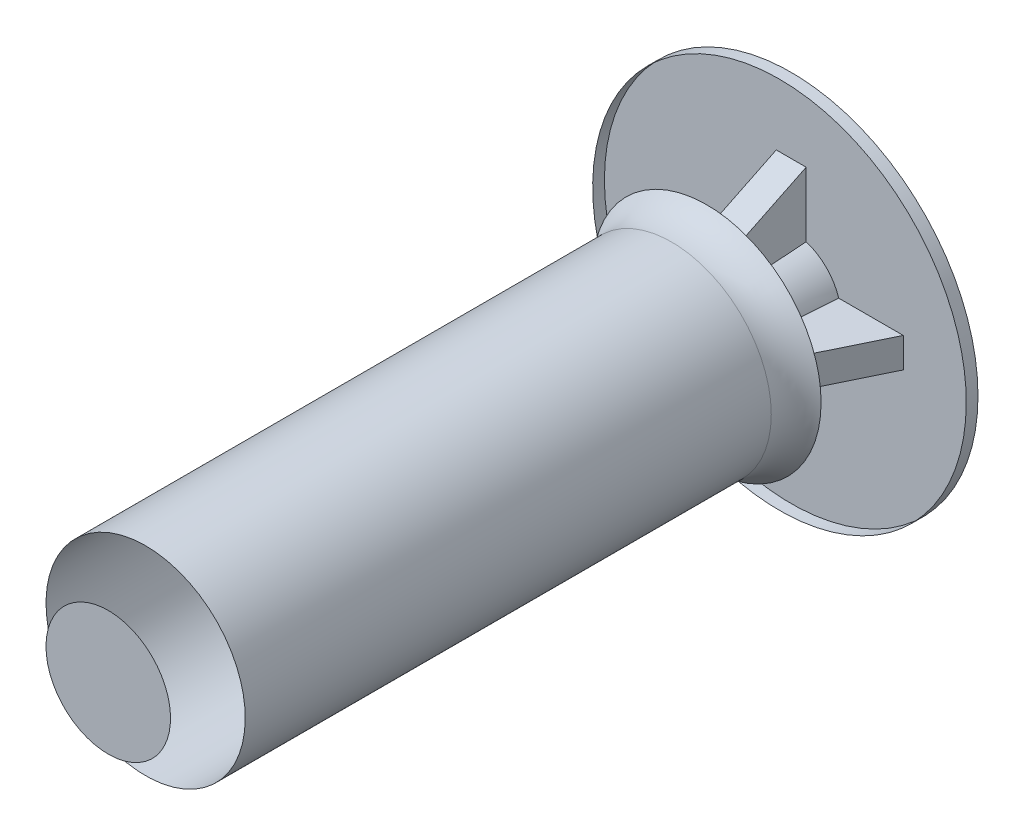
ISO-10303-21;
HEADER;
FILE_DESCRIPTION(('STEP AP214'),'2;1');
FILE_NAME('part.step','',(''),(''),'','','');
FILE_SCHEMA(('AUTOMOTIVE_DESIGN { 1 0 10303 214 1 1 1 1 }'));
ENDSEC;
DATA;
#1=APPLICATION_CONTEXT('core data for automotive mechanical design processes');
#2=APPLICATION_PROTOCOL_DEFINITION('international standard','automotive_design',2000,#1);
#3=PRODUCT_CONTEXT('',#1,'mechanical');
#4=PRODUCT('Part','Part','',(#3));
#5=PRODUCT_RELATED_PRODUCT_CATEGORY('part','',(#4));
#6=PRODUCT_DEFINITION_FORMATION('','',#4);
#7=PRODUCT_DEFINITION_CONTEXT('part definition',#1,'design');
#8=PRODUCT_DEFINITION('design','',#6,#7);
#9=PRODUCT_DEFINITION_SHAPE('','',#8);
#10=(LENGTH_UNIT() NAMED_UNIT(*) SI_UNIT(.MILLI.,.METRE.));
#11=(NAMED_UNIT(*) PLANE_ANGLE_UNIT() SI_UNIT($,.RADIAN.));
#12=(NAMED_UNIT(*) SI_UNIT($,.STERADIAN.) SOLID_ANGLE_UNIT());
#13=UNCERTAINTY_MEASURE_WITH_UNIT(LENGTH_MEASURE(1.E-05),#10,'distance_accuracy_value','');
#14=(GEOMETRIC_REPRESENTATION_CONTEXT(3) GLOBAL_UNCERTAINTY_ASSIGNED_CONTEXT((#13)) GLOBAL_UNIT_ASSIGNED_CONTEXT((#10,
#11,#12)) REPRESENTATION_CONTEXT('',''));
#15=CARTESIAN_POINT('',(0.,0.,0.));
#16=DIRECTION('',(0.,0.,1.));
#17=DIRECTION('',(1.,0.,0.));
#18=AXIS2_PLACEMENT_3D('',#15,#16,#17);
#19=CARTESIAN_POINT('',(125.418170518272,25.8086591382427,0.960431402518415));
#20=DIRECTION('',(0.,-0.898794046299167,-0.438371146789077));
#21=DIRECTION('',(0.,0.438371146789077,-0.898794046299167));
#22=AXIS2_PLACEMENT_3D('',#19,#20,#21);
#23=PLANE('',#22);
#24=DIRECTION('',(0.,-0.438371146789077,0.898794046299168));
#25=VECTOR('',#24,1.);
#26=CARTESIAN_POINT('',(125.818170518272,26.7353510565178,-0.939568597481593));
#27=LINE('',#26,#25);
#28=CARTESIAN_POINT('',(125.818170518272,26.7353510565178,-0.939568597481593));
#29=VERTEX_POINT('',#28);
#30=CARTESIAN_POINT('',(125.818170518272,25.8086591382427,0.960431402518415));
#31=VERTEX_POINT('',#30);
#32=EDGE_CURVE('E11',#29,#31,#27,.T.);
#33=ORIENTED_EDGE('',*,*,#32,.T.);
#34=DIRECTION('',(1.,0.,0.));
#35=VECTOR('',#34,1.);
#36=CARTESIAN_POINT('',(125.418170518272,25.8086591382427,0.960431402518415));
#37=LINE('',#36,#35);
#38=CARTESIAN_POINT('',(125.418170518272,25.8086591382427,0.960431402518415));
#39=VERTEX_POINT('',#38);
#40=EDGE_CURVE('E222',#39,#31,#37,.T.);
#41=ORIENTED_EDGE('',*,*,#40,.F.);
#42=DIRECTION('',(0.,-0.438371146789077,0.898794046299168));
#43=VECTOR('',#42,1.);
#44=CARTESIAN_POINT('',(125.418170518272,26.7353510565178,-0.939568597481593));
#45=LINE('',#44,#43);
#46=CARTESIAN_POINT('',(125.418170518272,26.7353510565178,-0.939568597481593));
#47=VERTEX_POINT('',#46);
#48=EDGE_CURVE('E50',#47,#39,#45,.T.);
#49=ORIENTED_EDGE('',*,*,#48,.F.);
#50=DIRECTION('',(1.,0.,0.));
#51=VECTOR('',#50,1.);
#52=CARTESIAN_POINT('',(125.418170518272,26.7353510565178,-0.939568597481593));
#53=LINE('',#52,#51);
#54=EDGE_CURVE('E251',#47,#29,#53,.T.);
#55=ORIENTED_EDGE('',*,*,#54,.T.);
#56=EDGE_LOOP('',(#33,#41,#49,#55));
#57=FACE_BOUND('',#56,.T.);
#58=ADVANCED_FACE('F40',(#57),#23,.T.);
#59=CARTESIAN_POINT('',(125.818170518272,25.2353510565178,22.3937647358519));
#60=DIRECTION('',(-1.,0.,0.));
#61=DIRECTION('',(0.,0.,1.));
#62=AXIS2_PLACEMENT_3D('',#59,#60,#61);
#63=PLANE('',#62);
#64=CARTESIAN_POINT('',(125.818170518272,25.8713105241291,-0.939568597481595));
#65=CARTESIAN_POINT('',(125.818170518272,25.7929876372384,0.128909574146506));
#66=CARTESIAN_POINT('',(125.818170518272,25.7302738292281,0.960431402521579));
#67=(BOUNDED_CURVE() B_SPLINE_CURVE(2,(#64,#65,#66),.UNSPECIFIED.,.F.,
.F.) B_SPLINE_CURVE_WITH_KNOTS((3,3),(-0.308985655980768,-0.121232772554277),
.UNSPECIFIED.) CURVE() GEOMETRIC_REPRESENTATION_ITEM() RATIONAL_B_SPLINE_CURVE((1.01015110004332,
1.01867499152316,1.0130918345203)) REPRESENTATION_ITEM(''));
#68=CARTESIAN_POINT('',(125.818170518272,25.8713105241291,-0.939568597481597));
#69=VERTEX_POINT('',#68);
#70=CARTESIAN_POINT('',(125.818170518272,25.7302738292282,0.960431402518415));
#71=VERTEX_POINT('',#70);
#72=EDGE_CURVE('E275',#69,#71,#67,.T.);
#73=ORIENTED_EDGE('',*,*,#72,.T.);
#74=DIRECTION('',(0.,-1.,0.));
#75=VECTOR('',#74,1.);
#76=CARTESIAN_POINT('',(125.818170518272,25.8086591382427,0.960431402518415));
#77=LINE('',#76,#75);
#78=EDGE_CURVE('E218',#31,#71,#77,.T.);
#79=ORIENTED_EDGE('',*,*,#78,.F.);
#80=ORIENTED_EDGE('',*,*,#32,.F.);
#81=DIRECTION('',(0.,1.,0.));
#82=VECTOR('',#81,1.);
#83=CARTESIAN_POINT('',(125.818170518272,25.8713105241291,-0.939568597481597));
#84=LINE('',#83,#82);
#85=EDGE_CURVE('E249',#69,#29,#84,.T.);
#86=ORIENTED_EDGE('',*,*,#85,.F.);
#87=EDGE_LOOP('',(#73,#79,#80,#86));
#88=FACE_BOUND('',#87,.T.);
#89=ADVANCED_FACE('F424',(#88),#63,.T.);
#90=CARTESIAN_POINT('',(125.418170518272,25.2353510565178,22.3937647358519));
#91=DIRECTION('',(1.,0.,0.));
#92=DIRECTION('',(0.,1.,0.));
#93=AXIS2_PLACEMENT_3D('',#90,#91,#92);
#94=PLANE('',#93);
#95=DIRECTION('',(0.,1.,0.));
#96=VECTOR('',#95,1.);
#97=CARTESIAN_POINT('',(125.418170518272,25.8713105241291,-0.939568597481591));
#98=LINE('',#97,#96);
#99=CARTESIAN_POINT('',(125.418170518272,25.8713105241291,-0.939568597481591));
#100=VERTEX_POINT('',#99);
#101=EDGE_CURVE('E253',#100,#47,#98,.T.);
#102=ORIENTED_EDGE('',*,*,#101,.T.);
#103=ORIENTED_EDGE('',*,*,#48,.T.);
#104=DIRECTION('',(0.,-1.,0.));
#105=VECTOR('',#104,1.);
#106=CARTESIAN_POINT('',(125.418170518272,25.8086591382427,0.960431402518415));
#107=LINE('',#106,#105);
#108=CARTESIAN_POINT('',(125.418170518272,25.7302738292282,0.960431402518415));
#109=VERTEX_POINT('',#108);
#110=EDGE_CURVE('E243',#39,#109,#107,.T.);
#111=ORIENTED_EDGE('',*,*,#110,.T.);
#112=CARTESIAN_POINT('',(125.418170518272,25.8713105241291,-0.939568597481589));
#113=CARTESIAN_POINT('',(125.418170518272,25.7929876372383,0.128909574147783));
#114=CARTESIAN_POINT('',(125.418170518272,25.730273829228,0.960431402521576));
#115=(BOUNDED_CURVE() B_SPLINE_CURVE(2,(#112,#113,#114),.UNSPECIFIED.,.F.,
.F.) B_SPLINE_CURVE_WITH_KNOTS((3,3),(0.0820940839671084,0.269846967393734),
.UNSPECIFIED.) CURVE() GEOMETRIC_REPRESENTATION_ITEM() RATIONAL_B_SPLINE_CURVE((1.01015110004458,
1.01867499152554,1.01309183452199)) REPRESENTATION_ITEM(''));
#116=EDGE_CURVE('E283',#100,#109,#115,.T.);
#117=ORIENTED_EDGE('',*,*,#116,.F.);
#118=EDGE_LOOP('',(#102,#103,#111,#117));
#119=FACE_BOUND('',#118,.T.);
#120=ADVANCED_FACE('F430',(#119),#94,.T.);
#121=CARTESIAN_POINT('',(125.418170518272,24.6620429747929,0.960431402518416));
#122=DIRECTION('',(0.,0.898794046299166,-0.43837114678908));
#123=DIRECTION('',(-1.,0.,0.));
#124=AXIS2_PLACEMENT_3D('',#121,#122,#123);
#125=PLANE('',#124);
#126=DIRECTION('',(0.,-0.438371146789079,-0.898794046299166));
#127=VECTOR('',#126,1.);
#128=CARTESIAN_POINT('',(125.818170518272,24.6620429747929,0.960431402518416));
#129=LINE('',#128,#127);
#130=CARTESIAN_POINT('',(125.818170518272,24.6620429747929,0.960431402518416));
#131=VERTEX_POINT('',#130);
#132=CARTESIAN_POINT('',(125.818170518272,23.7353510565178,-0.939568597481588));
#133=VERTEX_POINT('',#132);
#134=EDGE_CURVE('E154',#131,#133,#129,.T.);
#135=ORIENTED_EDGE('',*,*,#134,.T.);
#136=DIRECTION('',(1.,0.,0.));
#137=VECTOR('',#136,1.);
#138=CARTESIAN_POINT('',(125.418170518272,23.7353510565178,-0.939568597481588));
#139=LINE('',#138,#137);
#140=CARTESIAN_POINT('',(125.418170518272,23.7353510565178,-0.939568597481588));
#141=VERTEX_POINT('',#140);
#142=EDGE_CURVE('E186',#141,#133,#139,.T.);
#143=ORIENTED_EDGE('',*,*,#142,.F.);
#144=DIRECTION('',(0.,-0.438371146789079,-0.898794046299166));
#145=VECTOR('',#144,1.);
#146=CARTESIAN_POINT('',(125.418170518272,24.6620429747929,0.960431402518416));
#147=LINE('',#146,#145);
#148=CARTESIAN_POINT('',(125.418170518272,24.6620429747929,0.960431402518416));
#149=VERTEX_POINT('',#148);
#150=EDGE_CURVE('E147',#149,#141,#147,.T.);
#151=ORIENTED_EDGE('',*,*,#150,.F.);
#152=DIRECTION('',(1.,0.,0.));
#153=VECTOR('',#152,1.);
#154=CARTESIAN_POINT('',(125.418170518272,24.6620429747929,0.960431402518416));
#155=LINE('',#154,#153);
#156=EDGE_CURVE('E271',#149,#131,#155,.T.);
#157=ORIENTED_EDGE('',*,*,#156,.T.);
#158=EDGE_LOOP('',(#135,#143,#151,#157));
#159=FACE_BOUND('',#158,.T.);
#160=ADVANCED_FACE('F457',(#159),#125,.T.);
#161=CARTESIAN_POINT('',(125.418170518272,25.2353510565178,22.3937647358519));
#162=DIRECTION('',(1.,0.,0.));
#163=DIRECTION('',(0.,1.,0.));
#164=AXIS2_PLACEMENT_3D('',#161,#162,#163);
#165=PLANE('',#164);
#166=DIRECTION('',(0.,-1.,0.));
#167=VECTOR('',#166,1.);
#168=CARTESIAN_POINT('',(125.418170518272,24.7404282838073,0.960431402518416));
#169=LINE('',#168,#167);
#170=CARTESIAN_POINT('',(125.418170518272,24.7404282838073,0.960431402518416));
#171=VERTEX_POINT('',#170);
#172=EDGE_CURVE('E236',#171,#149,#169,.T.);
#173=ORIENTED_EDGE('',*,*,#172,.T.);
#174=ORIENTED_EDGE('',*,*,#150,.T.);
#175=DIRECTION('',(0.,1.,0.));
#176=VECTOR('',#175,1.);
#177=CARTESIAN_POINT('',(125.418170518272,23.7353510565178,-0.939568597481588));
#178=LINE('',#177,#176);
#179=CARTESIAN_POINT('',(125.418170518272,24.5993915889065,-0.93956859748159));
#180=VERTEX_POINT('',#179);
#181=EDGE_CURVE('E242',#141,#180,#178,.T.);
#182=ORIENTED_EDGE('',*,*,#181,.T.);
#183=CARTESIAN_POINT('',(125.418170518272,24.7404282838076,0.960431402521571));
#184=CARTESIAN_POINT('',(125.418170518272,24.6777144757967,0.128909574139695));
#185=CARTESIAN_POINT('',(125.418170518272,24.5993915889065,-0.939568597481591));
#186=(BOUNDED_CURVE() B_SPLINE_CURVE(2,(#183,#184,#185),.UNSPECIFIED.,.F.,
.F.) B_SPLINE_CURVE_WITH_KNOTS((3,3),(0.121232772553211,0.308985655980115),
.UNSPECIFIED.) CURVE() GEOMETRIC_REPRESENTATION_ITEM() RATIONAL_B_SPLINE_CURVE((1.01309183451937,
1.01867499152197,1.01015110004274)) REPRESENTATION_ITEM(''));
#187=EDGE_CURVE('E331',#171,#180,#186,.T.);
#188=ORIENTED_EDGE('',*,*,#187,.F.);
#189=EDGE_LOOP('',(#173,#174,#182,#188));
#190=FACE_BOUND('',#189,.T.);
#191=ADVANCED_FACE('F450',(#190),#165,.T.);
#192=CARTESIAN_POINT('',(125.818170518272,25.2353510565178,22.3937647358519));
#193=DIRECTION('',(-1.,0.,0.));
#194=DIRECTION('',(0.,0.,1.));
#195=AXIS2_PLACEMENT_3D('',#192,#193,#194);
#196=PLANE('',#195);
#197=CARTESIAN_POINT('',(125.818170518272,24.7404282838075,0.960431402521576));
#198=CARTESIAN_POINT('',(125.818170518272,24.6777144757971,0.1289095741461));
#199=CARTESIAN_POINT('',(125.818170518272,24.5993915889065,-0.939568597481596));
#200=(BOUNDED_CURVE() B_SPLINE_CURVE(2,(#197,#198,#199),.UNSPECIFIED.,.F.,
.F.) B_SPLINE_CURVE_WITH_KNOTS((3,3),(-0.269846967394133,-0.0820940839673807),
.UNSPECIFIED.) CURVE() GEOMETRIC_REPRESENTATION_ITEM() RATIONAL_B_SPLINE_CURVE((1.01309183452152,
1.01867499152493,1.01015110004428)) REPRESENTATION_ITEM(''));
#201=CARTESIAN_POINT('',(125.818170518272,24.7404282838073,0.960431402518416));
#202=VERTEX_POINT('',#201);
#203=CARTESIAN_POINT('',(125.818170518272,24.5993915889065,-0.939568597481596));
#204=VERTEX_POINT('',#203);
#205=EDGE_CURVE('E190',#202,#204,#200,.T.);
#206=ORIENTED_EDGE('',*,*,#205,.T.);
#207=DIRECTION('',(0.,1.,0.));
#208=VECTOR('',#207,1.);
#209=CARTESIAN_POINT('',(125.818170518272,23.7353510565178,-0.939568597481588));
#210=LINE('',#209,#208);
#211=EDGE_CURVE('E177',#133,#204,#210,.T.);
#212=ORIENTED_EDGE('',*,*,#211,.F.);
#213=ORIENTED_EDGE('',*,*,#134,.F.);
#214=DIRECTION('',(0.,-1.,0.));
#215=VECTOR('',#214,1.);
#216=CARTESIAN_POINT('',(125.818170518272,24.7404282838073,0.960431402518416));
#217=LINE('',#216,#215);
#218=EDGE_CURVE('E193',#202,#131,#217,.T.);
#219=ORIENTED_EDGE('',*,*,#218,.F.);
#220=EDGE_LOOP('',(#206,#212,#213,#219));
#221=FACE_BOUND('',#220,.T.);
#222=ADVANCED_FACE('F191',(#221),#196,.T.);
#223=CARTESIAN_POINT('',(124.118170518272,25.4353510565178,-0.939568597481597));
#224=DIRECTION('',(0.898794046299166,0.,-0.438371146789079));
#225=DIRECTION('',(0.,-1.,0.));
#226=AXIS2_PLACEMENT_3D('',#223,#224,#225);
#227=PLANE('',#226);
#228=DIRECTION('',(-0.438371146789087,0.,-0.898794046299162));
#229=VECTOR('',#228,1.);
#230=CARTESIAN_POINT('',(125.044862436547,25.0353510565178,0.960431402518416));
#231=LINE('',#230,#229);
#232=CARTESIAN_POINT('',(125.044862436547,25.0353510565178,0.960431402518416));
#233=VERTEX_POINT('',#232);
#234=CARTESIAN_POINT('',(124.118170518272,25.0353510565178,-0.93956859748159));
#235=VERTEX_POINT('',#234);
#236=EDGE_CURVE('E115',#233,#235,#231,.T.);
#237=ORIENTED_EDGE('',*,*,#236,.T.);
#238=DIRECTION('',(0.,-1.,0.));
#239=VECTOR('',#238,1.);
#240=CARTESIAN_POINT('',(124.118170518272,25.4353510565178,-0.939568597481597));
#241=LINE('',#240,#239);
#242=CARTESIAN_POINT('',(124.118170518272,25.4353510565178,-0.939568597481597));
#243=VERTEX_POINT('',#242);
#244=EDGE_CURVE('E217',#243,#235,#241,.T.);
#245=ORIENTED_EDGE('',*,*,#244,.F.);
#246=DIRECTION('',(-0.438371146789086,0.,-0.898794046299163));
#247=VECTOR('',#246,1.);
#248=CARTESIAN_POINT('',(125.044862436547,25.4353510565178,0.960431402518415));
#249=LINE('',#248,#247);
#250=CARTESIAN_POINT('',(125.044862436547,25.4353510565178,0.960431402518415));
#251=VERTEX_POINT('',#250);
#252=EDGE_CURVE('E315',#251,#243,#249,.T.);
#253=ORIENTED_EDGE('',*,*,#252,.F.);
#254=DIRECTION('',(0.,-1.,0.));
#255=VECTOR('',#254,1.);
#256=CARTESIAN_POINT('',(125.044862436547,25.4353510565178,0.960431402518415));
#257=LINE('',#256,#255);
#258=EDGE_CURVE('E354',#251,#233,#257,.T.);
#259=ORIENTED_EDGE('',*,*,#258,.T.);
#260=EDGE_LOOP('',(#237,#245,#253,#259));
#261=FACE_BOUND('',#260,.T.);
#262=ADVANCED_FACE('F445',(#261),#227,.T.);
#263=CARTESIAN_POINT('',(125.618170518272,25.0353510565178,22.3937647358519));
#264=DIRECTION('',(0.,1.,0.));
#265=DIRECTION('',(0.,0.,-1.));
#266=AXIS2_PLACEMENT_3D('',#263,#264,#265);
#267=PLANE('',#266);
#268=DIRECTION('',(1.,0.,0.));
#269=VECTOR('',#268,1.);
#270=CARTESIAN_POINT('',(124.118170518272,25.0353510565178,-0.93956859748159));
#271=LINE('',#270,#269);
#272=CARTESIAN_POINT('',(124.982211050661,25.0353510565178,-0.939568597481596));
#273=VERTEX_POINT('',#272);
#274=EDGE_CURVE('E210',#235,#273,#271,.T.);
#275=ORIENTED_EDGE('',*,*,#274,.F.);
#276=ORIENTED_EDGE('',*,*,#236,.F.);
#277=DIRECTION('',(-1.,0.,0.));
#278=VECTOR('',#277,1.);
#279=CARTESIAN_POINT('',(125.123247745561,25.0353510565178,0.960431402518416));
#280=LINE('',#279,#278);
#281=CARTESIAN_POINT('',(125.123247745561,25.0353510565178,0.960431402518416));
#282=VERTEX_POINT('',#281);
#283=EDGE_CURVE('E286',#282,#233,#280,.T.);
#284=ORIENTED_EDGE('',*,*,#283,.F.);
#285=CARTESIAN_POINT('',(124.982211050661,25.0353510565178,-0.939568597481598));
#286=CARTESIAN_POINT('',(125.060533937551,25.0353510565178,0.128909574147523));
#287=CARTESIAN_POINT('',(125.123247745562,25.0353510565178,0.960431402521571));
#288=(BOUNDED_CURVE() B_SPLINE_CURVE(2,(#285,#286,#287),.UNSPECIFIED.,.F.,
.F.) B_SPLINE_CURVE_WITH_KNOTS((3,3),(0.0820940839668961,0.269846967394747),
.UNSPECIFIED.) CURVE() GEOMETRIC_REPRESENTATION_ITEM() RATIONAL_B_SPLINE_CURVE((1.01015110004946,
1.0186749915346,1.01309183452823)) REPRESENTATION_ITEM(''));
#289=EDGE_CURVE('E124',#273,#282,#288,.T.);
#290=ORIENTED_EDGE('',*,*,#289,.F.);
#291=EDGE_LOOP('',(#275,#276,#284,#290));
#292=FACE_BOUND('',#291,.T.);
#293=ADVANCED_FACE('F448',(#292),#267,.T.);
#294=CARTESIAN_POINT('',(125.618170518272,25.4353510565178,22.3937647358519));
#295=DIRECTION('',(0.,-1.,0.));
#296=DIRECTION('',(-1.,0.,0.));
#297=AXIS2_PLACEMENT_3D('',#294,#295,#296);
#298=PLANE('',#297);
#299=CARTESIAN_POINT('',(124.982211050661,25.4353510565178,-0.939568597481596));
#300=CARTESIAN_POINT('',(125.060533937551,25.4353510565178,0.128909574144894));
#301=CARTESIAN_POINT('',(125.123247745562,25.4353510565178,0.960431402521573));
#302=(BOUNDED_CURVE() B_SPLINE_CURVE(2,(#299,#300,#301),.UNSPECIFIED.,.F.,
.F.) B_SPLINE_CURVE_WITH_KNOTS((3,3),(-0.308985655980549,-0.121232772553838),
.UNSPECIFIED.) CURVE() GEOMETRIC_REPRESENTATION_ITEM() RATIONAL_B_SPLINE_CURVE((1.01015110004365,
1.01867499152375,1.01309183452068)) REPRESENTATION_ITEM(''));
#303=CARTESIAN_POINT('',(124.982211050661,25.4353510565178,-0.939568597481597));
#304=VERTEX_POINT('',#303);
#305=CARTESIAN_POINT('',(125.123247745561,25.4353510565178,0.960431402518415));
#306=VERTEX_POINT('',#305);
#307=EDGE_CURVE('E223',#304,#306,#302,.T.);
#308=ORIENTED_EDGE('',*,*,#307,.T.);
#309=DIRECTION('',(-1.,0.,0.));
#310=VECTOR('',#309,1.);
#311=CARTESIAN_POINT('',(125.123247745561,25.4353510565178,0.960431402518415));
#312=LINE('',#311,#310);
#313=EDGE_CURVE('E245',#306,#251,#312,.T.);
#314=ORIENTED_EDGE('',*,*,#313,.T.);
#315=ORIENTED_EDGE('',*,*,#252,.T.);
#316=DIRECTION('',(1.,0.,0.));
#317=VECTOR('',#316,1.);
#318=CARTESIAN_POINT('',(124.118170518272,25.4353510565178,-0.939568597481597));
#319=LINE('',#318,#317);
#320=EDGE_CURVE('E328',#243,#304,#319,.T.);
#321=ORIENTED_EDGE('',*,*,#320,.T.);
#322=EDGE_LOOP('',(#308,#314,#315,#321));
#323=FACE_BOUND('',#322,.T.);
#324=ADVANCED_FACE('F467',(#323),#298,.T.);
#325=CARTESIAN_POINT('',(127.118170518272,25.4353510565178,-0.939568597481597));
#326=DIRECTION('',(-0.898794046299166,0.,-0.438371146789079));
#327=DIRECTION('',(-0.438371146789079,0.,0.898794046299166));
#328=AXIS2_PLACEMENT_3D('',#325,#326,#327);
#329=PLANE('',#328);
#330=DIRECTION('',(-0.438371146789086,0.,0.898794046299163));
#331=VECTOR('',#330,1.);
#332=CARTESIAN_POINT('',(127.118170518272,25.0353510565178,-0.939568597481596));
#333=LINE('',#332,#331);
#334=CARTESIAN_POINT('',(127.118170518272,25.0353510565178,-0.939568597481596));
#335=VERTEX_POINT('',#334);
#336=CARTESIAN_POINT('',(126.191478599997,25.0353510565178,0.960431402518416));
#337=VERTEX_POINT('',#336);
#338=EDGE_CURVE('E278',#335,#337,#333,.T.);
#339=ORIENTED_EDGE('',*,*,#338,.T.);
#340=DIRECTION('',(0.,-1.,0.));
#341=VECTOR('',#340,1.);
#342=CARTESIAN_POINT('',(126.191478599997,25.4353510565178,0.960431402518415));
#343=LINE('',#342,#341);
#344=CARTESIAN_POINT('',(126.191478599997,25.4353510565178,0.960431402518415));
#345=VERTEX_POINT('',#344);
#346=EDGE_CURVE('E234',#345,#337,#343,.T.);
#347=ORIENTED_EDGE('',*,*,#346,.F.);
#348=DIRECTION('',(-0.438371146789086,0.,0.898794046299163));
#349=VECTOR('',#348,1.);
#350=CARTESIAN_POINT('',(127.118170518272,25.4353510565178,-0.939568597481597));
#351=LINE('',#350,#349);
#352=CARTESIAN_POINT('',(127.118170518272,25.4353510565178,-0.939568597481597));
#353=VERTEX_POINT('',#352);
#354=EDGE_CURVE('E239',#353,#345,#351,.T.);
#355=ORIENTED_EDGE('',*,*,#354,.F.);
#356=DIRECTION('',(0.,-1.,0.));
#357=VECTOR('',#356,1.);
#358=CARTESIAN_POINT('',(127.118170518272,25.4353510565178,-0.939568597481597));
#359=LINE('',#358,#357);
#360=EDGE_CURVE('E250',#353,#335,#359,.T.);
#361=ORIENTED_EDGE('',*,*,#360,.T.);
#362=EDGE_LOOP('',(#339,#347,#355,#361));
#363=FACE_BOUND('',#362,.T.);
#364=ADVANCED_FACE('F453',(#363),#329,.T.);
#365=CARTESIAN_POINT('',(125.618170518272,25.0353510565178,22.3937647358519));
#366=DIRECTION('',(0.,1.,0.));
#367=DIRECTION('',(0.,0.,-1.));
#368=AXIS2_PLACEMENT_3D('',#365,#366,#367);
#369=PLANE('',#368);
#370=DIRECTION('',(-1.,0.,0.));
#371=VECTOR('',#370,1.);
#372=CARTESIAN_POINT('',(126.191478599997,25.0353510565178,0.960431402518416));
#373=LINE('',#372,#371);
#374=CARTESIAN_POINT('',(126.113093290982,25.0353510565178,0.960431402518416));
#375=VERTEX_POINT('',#374);
#376=EDGE_CURVE('E269',#337,#375,#373,.T.);
#377=ORIENTED_EDGE('',*,*,#376,.F.);
#378=ORIENTED_EDGE('',*,*,#338,.F.);
#379=DIRECTION('',(1.,0.,0.));
#380=VECTOR('',#379,1.);
#381=CARTESIAN_POINT('',(126.254129985883,25.0353510565178,-0.939568597481596));
#382=LINE('',#381,#380);
#383=CARTESIAN_POINT('',(126.254129985883,25.0353510565178,-0.939568597481596));
#384=VERTEX_POINT('',#383);
#385=EDGE_CURVE('E172',#384,#335,#382,.T.);
#386=ORIENTED_EDGE('',*,*,#385,.F.);
#387=CARTESIAN_POINT('',(126.113093290982,25.0353510565178,0.960431402518416));
#388=CARTESIAN_POINT('',(126.141769472786,25.0353510565178,0.58021416040147));
#389=CARTESIAN_POINT('',(126.170105618281,25.0353510565178,0.199969956499719));
#390=CARTESIAN_POINT('',(126.216952008864,25.0353510565178,-0.433375248202636));
#391=CARTESIAN_POINT('',(126.235577000768,25.0353510565178,-0.68646940258896));
#392=CARTESIAN_POINT('',(126.254129985883,25.0353510565178,-0.939568597481596));
#393=(BOUNDED_CURVE() B_SPLINE_CURVE(3,(#387,#388,#389,#390,#391,#392),.UNSPECIFIED.,.F.,
.F.) B_SPLINE_CURVE_WITH_KNOTS((4,2,4),(0.,0.600396597970285,1.),
.UNSPECIFIED.) CURVE() GEOMETRIC_REPRESENTATION_ITEM() RATIONAL_B_SPLINE_CURVE((1.,1.,1.,1.,1.,1.)) REPRESENTATION_ITEM(''));
#394=EDGE_CURVE('E200',#375,#384,#393,.T.);
#395=ORIENTED_EDGE('',*,*,#394,.F.);
#396=EDGE_LOOP('',(#377,#378,#386,#395));
#397=FACE_BOUND('',#396,.T.);
#398=ADVANCED_FACE('F440',(#397),#369,.T.);
#399=CARTESIAN_POINT('',(125.618170518272,25.4353510565178,22.3937647358519));
#400=DIRECTION('',(0.,-1.,0.));
#401=DIRECTION('',(-1.,0.,0.));
#402=AXIS2_PLACEMENT_3D('',#399,#400,#401);
#403=PLANE('',#402);
#404=CARTESIAN_POINT('',(126.113093290982,25.4353510565178,0.960431402518415));
#405=CARTESIAN_POINT('',(126.141769472786,25.4353510565178,0.580214160401468));
#406=CARTESIAN_POINT('',(126.170105618281,25.4353510565178,0.199969956499717));
#407=CARTESIAN_POINT('',(126.216952008864,25.4353510565178,-0.433375248202638));
#408=CARTESIAN_POINT('',(126.235577000768,25.4353510565178,-0.686469402588962));
#409=CARTESIAN_POINT('',(126.254129985883,25.4353510565178,-0.939568597481597));
#410=(BOUNDED_CURVE() B_SPLINE_CURVE(3,(#404,#405,#406,#407,#408,#409),.UNSPECIFIED.,.F.,
.F.) B_SPLINE_CURVE_WITH_KNOTS((4,2,4),(0.,0.600396597970285,1.),
.UNSPECIFIED.) CURVE() GEOMETRIC_REPRESENTATION_ITEM() RATIONAL_B_SPLINE_CURVE((1.,1.,1.,1.,1.,1.)) REPRESENTATION_ITEM(''));
#411=CARTESIAN_POINT('',(126.113093290982,25.4353510565178,0.960431402518415));
#412=VERTEX_POINT('',#411);
#413=CARTESIAN_POINT('',(126.254129985883,25.4353510565178,-0.939568597481597));
#414=VERTEX_POINT('',#413);
#415=EDGE_CURVE('E276',#412,#414,#410,.T.);
#416=ORIENTED_EDGE('',*,*,#415,.T.);
#417=DIRECTION('',(1.,0.,0.));
#418=VECTOR('',#417,1.);
#419=CARTESIAN_POINT('',(126.254129985883,25.4353510565178,-0.939568597481597));
#420=LINE('',#419,#418);
#421=EDGE_CURVE('E246',#414,#353,#420,.T.);
#422=ORIENTED_EDGE('',*,*,#421,.T.);
#423=ORIENTED_EDGE('',*,*,#354,.T.);
#424=DIRECTION('',(-1.,0.,0.));
#425=VECTOR('',#424,1.);
#426=CARTESIAN_POINT('',(126.191478599997,25.4353510565178,0.960431402518415));
#427=LINE('',#426,#425);
#428=EDGE_CURVE('E221',#345,#412,#427,.T.);
#429=ORIENTED_EDGE('',*,*,#428,.T.);
#430=EDGE_LOOP('',(#416,#422,#423,#429));
#431=FACE_BOUND('',#430,.T.);
#432=ADVANCED_FACE('F436',(#431),#403,.T.);
#433=CARTESIAN_POINT('',(125.618170518272,25.2353510565178,8.20089285563543));
#434=DIRECTION('',(0.,0.,1.));
#435=DIRECTION('',(1.,0.,0.));
#436=AXIS2_PLACEMENT_3D('',#433,#434,#435);
#437=PLANE('',#436);
#438=CARTESIAN_POINT('',(125.618170518272,25.2353510565178,8.20089285563543));
#439=DIRECTION('',(0.,0.,1.));
#440=DIRECTION('',(1.,0.,0.));
#441=AXIS2_PLACEMENT_3D('',#438,#439,#440);
#442=CIRCLE('',#441,0.833333333333286);
#443=CARTESIAN_POINT('',(126.414723223361,25.4801943379441,8.20089285563549));
#444=VERTEX_POINT('',#443);
#445=EDGE_CURVE('E240',#444,#444,#442,.T.);
#446=ORIENTED_EDGE('',*,*,#445,.T.);
#447=EDGE_LOOP('',(#446));
#448=FACE_BOUND('',#447,.T.);
#449=ADVANCED_FACE('F439',(#448),#437,.T.);
#450=CARTESIAN_POINT('',(125.618170518272,25.2353510565178,8.15089285563544));
#451=DIRECTION('',(0.,0.,-1.));
#452=DIRECTION('',(-0.955863246106971,-0.293811937711597,0.));
#453=AXIS2_PLACEMENT_3D('',#450,#451,#452);
#454=CONICAL_SURFACE('',#453,0.883333333333293,0.78539816339744);
#455=ORIENTED_EDGE('',*,*,#445,.F.);
#456=DIRECTION('',(0.675897383209226,0.207756413549426,-0.707106781186548));
#457=VECTOR('',#456,1.);
#458=CARTESIAN_POINT('',(126.462516385666,25.4948849348297,8.15089285563545));
#459=LINE('',#458,#457);
#460=CARTESIAN_POINT('',(126.892654846415,25.6271003067999,7.70089285563541));
#461=VERTEX_POINT('',#460);
#462=EDGE_CURVE('E59',#444,#461,#459,.T.);
#463=ORIENTED_EDGE('',*,*,#462,.T.);
#464=CARTESIAN_POINT('',(125.618170518272,25.2353510565178,7.70089285563543));
#465=DIRECTION('',(0.,0.,1.));
#466=DIRECTION('',(1.,0.,0.));
#467=AXIS2_PLACEMENT_3D('',#464,#465,#466);
#468=CIRCLE('',#467,1.33333333333331);
#469=CARTESIAN_POINT('',(126.951503851605,25.2353510565178,7.70089285563543));
#470=VERTEX_POINT('',#469);
#471=EDGE_CURVE('E263',#461,#470,#468,.T.);
#472=ORIENTED_EDGE('',*,*,#471,.T.);
#473=CARTESIAN_POINT('',(125.618170518272,25.2353510565178,7.70089285563543));
#474=DIRECTION('',(0.,0.,1.));
#475=DIRECTION('',(1.,0.,0.));
#476=AXIS2_PLACEMENT_3D('',#473,#474,#475);
#477=CIRCLE('',#476,1.33333333333331);
#478=EDGE_CURVE('E44',#470,#461,#477,.T.);
#479=ORIENTED_EDGE('',*,*,#478,.T.);
#480=ORIENTED_EDGE('',*,*,#462,.F.);
#481=EDGE_LOOP('',(#455,#463,#472,#479,#480));
#482=FACE_BOUND('',#481,.T.);
#483=ADVANCED_FACE('F461',(#482),#454,.T.);
#484=CARTESIAN_POINT('',(125.618170518272,25.2353510565178,4.18066212907692));
#485=DIRECTION('',(0.,0.,1.));
#486=DIRECTION('',(-1.,0.,0.));
#487=AXIS2_PLACEMENT_3D('',#484,#485,#486);
#488=CYLINDRICAL_SURFACE('',#487,1.33333333333331);
#489=ORIENTED_EDGE('',*,*,#471,.F.);
#490=ORIENTED_EDGE('',*,*,#478,.F.);
#491=DIRECTION('',(0.,0.,-1.));
#492=VECTOR('',#491,1.);
#493=CARTESIAN_POINT('',(126.951503851605,25.2353510565178,4.18066212907691));
#494=LINE('',#493,#492);
#495=CARTESIAN_POINT('',(126.951503851605,25.2353510565178,0.660431402518414));
#496=VERTEX_POINT('',#495);
#497=EDGE_CURVE('E205',#470,#496,#494,.T.);
#498=ORIENTED_EDGE('',*,*,#497,.T.);
#499=CARTESIAN_POINT('',(125.618170518272,25.2353510565178,0.660431402518417));
#500=DIRECTION('',(0.,0.,1.));
#501=DIRECTION('',(-0.309016994374956,0.951056516295151,0.));
#502=AXIS2_PLACEMENT_3D('',#499,#500,#501);
#503=CIRCLE('',#502,1.33333333333334);
#504=EDGE_CURVE('E264',#496,#496,#503,.T.);
#505=ORIENTED_EDGE('',*,*,#504,.T.);
#506=ORIENTED_EDGE('',*,*,#497,.F.);
#507=EDGE_LOOP('',(#489,#490,#498,#505,#506));
#508=FACE_BOUND('',#507,.T.);
#509=ADVANCED_FACE('F464',(#508),#488,.T.);
#510=CARTESIAN_POINT('',(125.618170518272,25.2353510565178,0.660431402518425));
#511=DIRECTION('',(0.,0.,-1.));
#512=DIRECTION('',(-1.,0.,0.));
#513=AXIS2_PLACEMENT_3D('',#510,#511,#512);
#514=TOROIDAL_SURFACE('',#513,2.,0.666666666666624);
#515=ORIENTED_EDGE('',*,*,#504,.F.);
#516=CARTESIAN_POINT('',(127.618170518272,25.2353510565178,0.660431402518368));
#517=DIRECTION('',(0.,-1.,0.));
#518=DIRECTION('',(1.,0.,0.));
#519=AXIS2_PLACEMENT_3D('',#516,#517,#518);
#520=CIRCLE('',#519,0.666666666666624);
#521=CARTESIAN_POINT('',(127.146765997481,25.2353510565178,0.189026881727381));
#522=VERTEX_POINT('',#521);
#523=EDGE_CURVE('E257',#496,#522,#520,.T.);
#524=ORIENTED_EDGE('',*,*,#523,.T.);
#525=CARTESIAN_POINT('',(125.618170518272,25.2353510565178,0.18902688172738));
#526=DIRECTION('',(0.,0.,1.));
#527=DIRECTION('',(1.,0.,0.));
#528=AXIS2_PLACEMENT_3D('',#525,#526,#527);
#529=CIRCLE('',#528,1.528595479209);
#530=CARTESIAN_POINT('',(127.079298755013,25.6844706562413,0.189026881727393));
#531=VERTEX_POINT('',#530);
#532=EDGE_CURVE('E300',#522,#531,#529,.T.);
#533=ORIENTED_EDGE('',*,*,#532,.T.);
#534=CARTESIAN_POINT('',(125.618170518272,25.2353510565178,0.18902688172738));
#535=DIRECTION('',(0.,0.,1.));
#536=DIRECTION('',(1.,0.,0.));
#537=AXIS2_PLACEMENT_3D('',#534,#535,#536);
#538=CIRCLE('',#537,1.528595479209);
#539=EDGE_CURVE('E289',#531,#522,#538,.T.);
#540=ORIENTED_EDGE('',*,*,#539,.T.);
#541=ORIENTED_EDGE('',*,*,#523,.F.);
#542=EDGE_LOOP('',(#515,#524,#533,#540,#541));
#543=FACE_BOUND('',#542,.T.);
#544=ADVANCED_FACE('F443',(#543),#514,.F.);
#545=CARTESIAN_POINT('',(125.618170518272,25.2353510565178,0.0918864296482856));
#546=DIRECTION('',(0.,0.,-1.));
#547=DIRECTION('',(-0.95586324610698,-0.293811937711568,0.));
#548=AXIS2_PLACEMENT_3D('',#545,#546,#547);
#549=CONICAL_SURFACE('',#548,1.62573593128807,0.785398163397444);
#550=ORIENTED_EDGE('',*,*,#539,.F.);
#551=DIRECTION('',(0.675897383209232,0.207756413549412,-0.707106781186546));
#552=VECTOR('',#551,1.);
#553=CARTESIAN_POINT('',(127.172151742866,25.7130116806968,0.0918864296482947));
#554=LINE('',#553,#552);
#555=CARTESIAN_POINT('',(128.007828633539,25.9698809007967,-0.782377639063686));
#556=VERTEX_POINT('',#555);
#557=EDGE_CURVE('E292',#531,#556,#554,.T.);
#558=ORIENTED_EDGE('',*,*,#557,.T.);
#559=CARTESIAN_POINT('',(125.618170518272,25.2353510565178,-0.782377639063662));
#560=DIRECTION('',(0.,0.,1.));
#561=DIRECTION('',(1.,0.,0.));
#562=AXIS2_PLACEMENT_3D('',#559,#560,#561);
#563=CIRCLE('',#562,2.5);
#564=CARTESIAN_POINT('',(128.118170518272,25.2353510565178,-0.782377639063654));
#565=VERTEX_POINT('',#564);
#566=EDGE_CURVE('E335',#556,#565,#563,.T.);
#567=ORIENTED_EDGE('',*,*,#566,.T.);
#568=CARTESIAN_POINT('',(125.618170518272,25.2353510565178,-0.782377639063662));
#569=DIRECTION('',(0.,0.,1.));
#570=DIRECTION('',(1.,0.,0.));
#571=AXIS2_PLACEMENT_3D('',#568,#569,#570);
#572=CIRCLE('',#571,2.5);
#573=EDGE_CURVE('E341',#565,#556,#572,.T.);
#574=ORIENTED_EDGE('',*,*,#573,.T.);
#575=ORIENTED_EDGE('',*,*,#557,.F.);
#576=ORIENTED_EDGE('',*,*,#532,.F.);
#577=EDGE_LOOP('',(#550,#558,#567,#574,#575,#576));
#578=FACE_BOUND('',#577,.T.);
#579=ADVANCED_FACE('F387',(#578),#549,.T.);
#580=CARTESIAN_POINT('',(125.618170518272,25.2353510565178,-0.860973118272631));
#581=DIRECTION('',(0.,0.,1.));
#582=DIRECTION('',(-1.,0.,0.));
#583=AXIS2_PLACEMENT_3D('',#580,#581,#582);
#584=CYLINDRICAL_SURFACE('',#583,2.5);
#585=ORIENTED_EDGE('',*,*,#566,.F.);
#586=ORIENTED_EDGE('',*,*,#573,.F.);
#587=DIRECTION('',(0.,0.,-1.));
#588=VECTOR('',#587,1.);
#589=CARTESIAN_POINT('',(128.118170518272,25.2353510565178,-0.860973118272631));
#590=LINE('',#589,#588);
#591=CARTESIAN_POINT('',(128.118170518272,25.2353510565178,-0.939568597481596));
#592=VERTEX_POINT('',#591);
#593=EDGE_CURVE('E293',#565,#592,#590,.T.);
#594=ORIENTED_EDGE('',*,*,#593,.T.);
#595=CARTESIAN_POINT('',(125.618170518272,25.2353510565178,-0.939568597481589));
#596=DIRECTION('',(0.,0.,1.));
#597=DIRECTION('',(1.,0.,0.));
#598=AXIS2_PLACEMENT_3D('',#595,#596,#597);
#599=CIRCLE('',#598,2.5);
#600=EDGE_CURVE('E325',#592,#592,#599,.T.);
#601=ORIENTED_EDGE('',*,*,#600,.T.);
#602=ORIENTED_EDGE('',*,*,#593,.F.);
#603=EDGE_LOOP('',(#585,#586,#594,#601,#602));
#604=FACE_BOUND('',#603,.T.);
#605=ADVANCED_FACE('F393',(#604),#584,.T.);
#606=CARTESIAN_POINT('',(125.618170518272,25.2353510565178,0.770431402518433));
#607=DIRECTION('',(0.,0.,-1.));
#608=DIRECTION('',(-0.921773784097499,-0.387728114728061,0.));
#609=AXIS2_PLACEMENT_3D('',#606,#607,#608);
#610=CONICAL_SURFACE('',#609,0.547091818243198,0.0698131700798089);
#611=CARTESIAN_POINT('',(125.618170518272,25.2353510565178,-0.939568597481599));
#612=DIRECTION('',(0.,0.,1.));
#613=DIRECTION('',(-0.300000000000011,-0.953939201416942,0.));
#614=AXIS2_PLACEMENT_3D('',#611,#612,#613);
#615=CIRCLE('',#614,0.666666666666699);
#616=EDGE_CURVE('E216',#273,#180,#615,.T.);
#617=ORIENTED_EDGE('',*,*,#616,.F.);
#618=ORIENTED_EDGE('',*,*,#289,.T.);
#619=CARTESIAN_POINT('',(125.618170518272,25.2353510565178,0.960431402518412));
#620=DIRECTION('',(0.,0.,1.));
#621=DIRECTION('',(-0.374668144266151,-0.92715898403249,0.));
#622=AXIS2_PLACEMENT_3D('',#619,#620,#621);
#623=CIRCLE('',#622,0.53380572397404);
#624=EDGE_CURVE('E235',#282,#171,#623,.T.);
#625=ORIENTED_EDGE('',*,*,#624,.T.);
#626=ORIENTED_EDGE('',*,*,#187,.T.);
#627=EDGE_LOOP('',(#617,#618,#625,#626));
#628=FACE_BOUND('',#627,.T.);
#629=ADVANCED_FACE('F42',(#628),#610,.F.);
#630=CARTESIAN_POINT('',(126.151976242246,25.2353510565178,0.960431402518416));
#631=DIRECTION('',(0.,0.,-1.));
#632=DIRECTION('',(-1.,0.,0.));
#633=AXIS2_PLACEMENT_3D('',#630,#631,#632);
#634=PLANE('',#633);
#635=ORIENTED_EDGE('',*,*,#283,.T.);
#636=ORIENTED_EDGE('',*,*,#258,.F.);
#637=ORIENTED_EDGE('',*,*,#313,.F.);
#638=CARTESIAN_POINT('',(125.618170518272,25.2353510565178,0.960431402518412));
#639=DIRECTION('',(0.,0.,1.));
#640=DIRECTION('',(-0.927158984032486,0.374668144266162,0.));
#641=AXIS2_PLACEMENT_3D('',#638,#639,#640);
#642=CIRCLE('',#641,0.533805723973978);
#643=EDGE_CURVE('E229',#109,#306,#642,.T.);
#644=ORIENTED_EDGE('',*,*,#643,.F.);
#645=ORIENTED_EDGE('',*,*,#110,.F.);
#646=ORIENTED_EDGE('',*,*,#40,.T.);
#647=ORIENTED_EDGE('',*,*,#78,.T.);
#648=CARTESIAN_POINT('',(125.618170518272,25.2353510565179,0.960431402518415));
#649=DIRECTION('',(0.,0.,1.));
#650=DIRECTION('',(0.374668144266149,0.927158984032491,0.));
#651=AXIS2_PLACEMENT_3D('',#648,#649,#650);
#652=CIRCLE('',#651,0.533805723973929);
#653=EDGE_CURVE('E272',#412,#71,#652,.T.);
#654=ORIENTED_EDGE('',*,*,#653,.F.);
#655=ORIENTED_EDGE('',*,*,#428,.F.);
#656=ORIENTED_EDGE('',*,*,#346,.T.);
#657=ORIENTED_EDGE('',*,*,#376,.T.);
#658=CARTESIAN_POINT('',(125.618170518272,25.2353510565178,0.960431402518415));
#659=DIRECTION('',(0.,0.,1.));
#660=DIRECTION('',(0.927158984032489,-0.374668144266152,0.));
#661=AXIS2_PLACEMENT_3D('',#658,#659,#660);
#662=CIRCLE('',#661,0.533805723974067);
#663=EDGE_CURVE('E197',#202,#375,#662,.T.);
#664=ORIENTED_EDGE('',*,*,#663,.F.);
#665=ORIENTED_EDGE('',*,*,#218,.T.);
#666=ORIENTED_EDGE('',*,*,#156,.F.);
#667=ORIENTED_EDGE('',*,*,#172,.F.);
#668=ORIENTED_EDGE('',*,*,#624,.F.);
#669=EDGE_LOOP('',(#635,#636,#637,#644,#645,#646,#647,#654,#655,#656,#657,#664,#665,#666,#667,#668));
#670=FACE_BOUND('',#669,.T.);
#671=ADVANCED_FACE('F411',(#670),#634,.T.);
#672=CARTESIAN_POINT('',(126.284837184939,25.2353510565178,-0.939568597481593));
#673=DIRECTION('',(0.,0.,-1.));
#674=DIRECTION('',(-1.,0.,0.));
#675=AXIS2_PLACEMENT_3D('',#672,#673,#674);
#676=PLANE('',#675);
#677=CARTESIAN_POINT('',(125.618170518272,25.2353510565178,-0.939568597481585));
#678=DIRECTION('',(0.,0.,1.));
#679=DIRECTION('',(-0.953939201416951,0.299999999999984,0.));
#680=AXIS2_PLACEMENT_3D('',#677,#678,#679);
#681=CIRCLE('',#680,0.666666666666652);
#682=EDGE_CURVE('E228',#100,#304,#681,.T.);
#683=ORIENTED_EDGE('',*,*,#682,.T.);
#684=ORIENTED_EDGE('',*,*,#320,.F.);
#685=ORIENTED_EDGE('',*,*,#244,.T.);
#686=ORIENTED_EDGE('',*,*,#274,.T.);
#687=ORIENTED_EDGE('',*,*,#616,.T.);
#688=ORIENTED_EDGE('',*,*,#181,.F.);
#689=ORIENTED_EDGE('',*,*,#142,.T.);
#690=ORIENTED_EDGE('',*,*,#211,.T.);
#691=CARTESIAN_POINT('',(125.618170518272,25.2353510565178,-0.939568597481597));
#692=DIRECTION('',(0.,0.,1.));
#693=DIRECTION('',(0.953939201416949,-0.299999999999989,0.));
#694=AXIS2_PLACEMENT_3D('',#691,#692,#693);
#695=CIRCLE('',#694,0.666666666666713);
#696=EDGE_CURVE('E183',#204,#384,#695,.T.);
#697=ORIENTED_EDGE('',*,*,#696,.T.);
#698=ORIENTED_EDGE('',*,*,#385,.T.);
#699=ORIENTED_EDGE('',*,*,#360,.F.);
#700=ORIENTED_EDGE('',*,*,#421,.F.);
#701=CARTESIAN_POINT('',(125.618170518272,25.2353510565178,-0.939568597481596));
#702=DIRECTION('',(0.,0.,1.));
#703=DIRECTION('',(0.3,0.953939201416945,0.));
#704=AXIS2_PLACEMENT_3D('',#701,#702,#703);
#705=CIRCLE('',#704,0.666666666666623);
#706=EDGE_CURVE('E202',#414,#69,#705,.T.);
#707=ORIENTED_EDGE('',*,*,#706,.T.);
#708=ORIENTED_EDGE('',*,*,#85,.T.);
#709=ORIENTED_EDGE('',*,*,#54,.F.);
#710=ORIENTED_EDGE('',*,*,#101,.F.);
#711=EDGE_LOOP('',(#683,#684,#685,#686,#687,#688,#689,#690,#697,#698,#699,#700,#707,#708,#709,#710));
#712=FACE_BOUND('',#711,.T.);
#713=ORIENTED_EDGE('',*,*,#600,.F.);
#714=EDGE_LOOP('',(#713));
#715=FACE_BOUND('',#714,.T.);
#716=ADVANCED_FACE('F180',(#712,#715),#676,.T.);
#717=CARTESIAN_POINT('',(125.618170518272,25.2353510565178,0.770431402518426));
#718=DIRECTION('',(0.,0.,-1.));
#719=DIRECTION('',(-0.387728114728052,0.921773784097503,0.));
#720=AXIS2_PLACEMENT_3D('',#717,#718,#719);
#721=CONICAL_SURFACE('',#720,0.547091818243255,0.069813170079793);
#722=ORIENTED_EDGE('',*,*,#643,.T.);
#723=ORIENTED_EDGE('',*,*,#307,.F.);
#724=ORIENTED_EDGE('',*,*,#682,.F.);
#725=ORIENTED_EDGE('',*,*,#116,.T.);
#726=EDGE_LOOP('',(#722,#723,#724,#725));
#727=FACE_BOUND('',#726,.T.);
#728=ADVANCED_FACE('F410',(#727),#721,.F.);
#729=CARTESIAN_POINT('',(125.618170518272,25.2353510565178,0.770431402518417));
#730=DIRECTION('',(0.,0.,-1.));
#731=DIRECTION('',(0.38772811472809,-0.921773784097487,0.));
#732=AXIS2_PLACEMENT_3D('',#729,#730,#731);
#733=CONICAL_SURFACE('',#732,0.54709181824325,0.0698131700797755);
#734=ORIENTED_EDGE('',*,*,#394,.T.);
#735=ORIENTED_EDGE('',*,*,#696,.F.);
#736=ORIENTED_EDGE('',*,*,#205,.F.);
#737=ORIENTED_EDGE('',*,*,#663,.T.);
#738=EDGE_LOOP('',(#734,#735,#736,#737));
#739=FACE_BOUND('',#738,.T.);
#740=ADVANCED_FACE('F199',(#739),#733,.F.);
#741=CARTESIAN_POINT('',(125.618170518272,25.2353510565177,0.770431402518371));
#742=DIRECTION('',(0.,0.,-1.));
#743=DIRECTION('',(0.921773784097447,0.387728114728185,0.));
#744=AXIS2_PLACEMENT_3D('',#741,#742,#743);
#745=CONICAL_SURFACE('',#744,0.547091818243448,0.0698131700796864);
#746=ORIENTED_EDGE('',*,*,#415,.F.);
#747=ORIENTED_EDGE('',*,*,#653,.T.);
#748=ORIENTED_EDGE('',*,*,#72,.F.);
#749=ORIENTED_EDGE('',*,*,#706,.F.);
#750=EDGE_LOOP('',(#746,#747,#748,#749));
#751=FACE_BOUND('',#750,.T.);
#752=ADVANCED_FACE('F495',(#751),#745,.F.);
#753=CLOSED_SHELL('',(#58,#89,#120,#160,#191,#222,#262,#293,#324,#364,#398,#432,#449,#483,#509,
#544,#579,#605,#629,#671,#716,#728,#740,#752));
#754=MANIFOLD_SOLID_BREP('B2',#753);
#755=ADVANCED_BREP_SHAPE_REPRESENTATION('',(#18,#754),#14);
#756=SHAPE_DEFINITION_REPRESENTATION(#9,#755);
ENDSEC;
END-ISO-10303-21;
